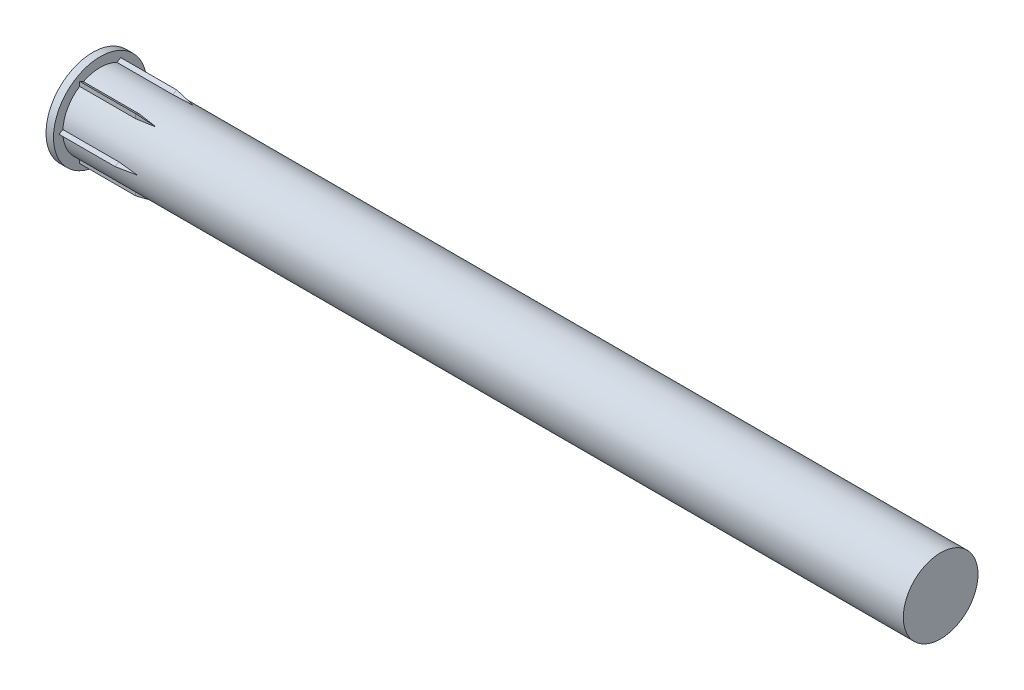
ISO-10303-21;
HEADER;
FILE_DESCRIPTION(('STEP AP214'),'2;1');
FILE_NAME('part.step','',(''),(''),'','','');
FILE_SCHEMA(('AUTOMOTIVE_DESIGN { 1 0 10303 214 1 1 1 1 }'));
ENDSEC;
DATA;
#1=APPLICATION_CONTEXT('core data for automotive mechanical design processes');
#2=APPLICATION_PROTOCOL_DEFINITION('international standard','automotive_design',2000,#1);
#3=PRODUCT_CONTEXT('',#1,'mechanical');
#4=PRODUCT('Part','Part','',(#3));
#5=PRODUCT_RELATED_PRODUCT_CATEGORY('part','',(#4));
#6=PRODUCT_DEFINITION_FORMATION('','',#4);
#7=PRODUCT_DEFINITION_CONTEXT('part definition',#1,'design');
#8=PRODUCT_DEFINITION('design','',#6,#7);
#9=PRODUCT_DEFINITION_SHAPE('','',#8);
#10=(LENGTH_UNIT() NAMED_UNIT(*) SI_UNIT(.MILLI.,.METRE.));
#11=(NAMED_UNIT(*) PLANE_ANGLE_UNIT() SI_UNIT($,.RADIAN.));
#12=(NAMED_UNIT(*) SI_UNIT($,.STERADIAN.) SOLID_ANGLE_UNIT());
#13=UNCERTAINTY_MEASURE_WITH_UNIT(LENGTH_MEASURE(1.E-05),#10,'distance_accuracy_value','');
#14=(GEOMETRIC_REPRESENTATION_CONTEXT(3) GLOBAL_UNCERTAINTY_ASSIGNED_CONTEXT((#13)) GLOBAL_UNIT_ASSIGNED_CONTEXT((#10,
#11,#12)) REPRESENTATION_CONTEXT('',''));
#15=CARTESIAN_POINT('',(0.,0.,0.));
#16=DIRECTION('',(0.,0.,1.));
#17=DIRECTION('',(1.,0.,0.));
#18=AXIS2_PLACEMENT_3D('',#15,#16,#17);
#19=CARTESIAN_POINT('',(3.,1.78779259859,0.896547614149));
#20=DIRECTION('',(0.0995037190192296,0.861727484432255,-0.497518595105147));
#21=DIRECTION('',(-0.980580675691602,0.,-0.196116135134773));
#22=AXIS2_PLACEMENT_3D('',#19,#20,#21);
#23=PLANE('',#22);
#24=CARTESIAN_POINT('',(3.0000000814,1.78779283971,0.896547133324));
#25=CARTESIAN_POINT('',(3.33074926986,1.77003985664,0.931948123239));
#26=CARTESIAN_POINT('',(3.66423295742,1.75143632677,0.96642330872));
#27=CARTESIAN_POINT('',(3.99999971952419,1.73205065846404,1.00000025825317));
#28=(BOUNDED_CURVE() B_SPLINE_CURVE(3,(#24,#25,#26,#27),.UNSPECIFIED.,.F.,
.F.) B_SPLINE_CURVE_WITH_KNOTS((4,4),(0.,1.00688422443),
.UNSPECIFIED.) CURVE() GEOMETRIC_REPRESENTATION_ITEM() RATIONAL_B_SPLINE_CURVE((1.,1.,1.,1.)) REPRESENTATION_ITEM(''));
#29=CARTESIAN_POINT('',(3.0000000814,1.78779283971,0.896547133324));
#30=VERTEX_POINT('',#29);
#31=CARTESIAN_POINT('',(3.99999974596,1.73205077294,1.00000005999));
#32=VERTEX_POINT('',#31);
#33=EDGE_CURVE('E261',#30,#32,#28,.T.);
#34=ORIENTED_EDGE('',*,*,#33,.F.);
#35=DIRECTION('',(0.,-0.50000000000019,-0.866025403784329));
#36=VECTOR('',#35,1.);
#37=CARTESIAN_POINT('',(3.,1.84652424346,0.998273807074));
#38=LINE('',#37,#36);
#39=CARTESIAN_POINT('',(3.,1.90525588833,1.1));
#40=VERTEX_POINT('',#39);
#41=EDGE_CURVE('E11',#40,#30,#38,.T.);
#42=ORIENTED_EDGE('',*,*,#41,.F.);
#43=DIRECTION('',(0.980580675690525,-0.169841555121918,-0.0980580675726525));
#44=VECTOR('',#43,1.);
#45=CARTESIAN_POINT('',(3.5,1.81865334795,1.05));
#46=LINE('',#45,#44);
#47=EDGE_CURVE('E221',#40,#32,#46,.T.);
#48=ORIENTED_EDGE('',*,*,#47,.T.);
#49=EDGE_LOOP('',(#34,#42,#48));
#50=FACE_BOUND('',#49,.T.);
#51=ADVANCED_FACE('F16',(#50),#23,.T.);
#52=CARTESIAN_POINT('',(3.,1.78779259859,0.896547614149));
#53=DIRECTION('',(0.,-0.866025403784329,0.50000000000019));
#54=DIRECTION('',(-1.,0.,0.));
#55=AXIS2_PLACEMENT_3D('',#52,#53,#54);
#56=PLANE('',#55);
#57=ORIENTED_EDGE('',*,*,#41,.T.);
#58=DIRECTION('',(1.,0.,0.));
#59=VECTOR('',#58,1.);
#60=CARTESIAN_POINT('',(22.5,1.78779259859,0.896547614152));
#61=LINE('',#60,#59);
#62=CARTESIAN_POINT('',(0.,1.78779265775987,0.896547496153935));
#63=VERTEX_POINT('',#62);
#64=EDGE_CURVE('E309',#63,#30,#61,.T.);
#65=ORIENTED_EDGE('',*,*,#64,.F.);
#66=DIRECTION('',(0.,0.50000000000019,0.866025403784329));
#67=VECTOR('',#66,1.);
#68=CARTESIAN_POINT('',(0.,1.2701705922195,0.));
#69=LINE('',#68,#67);
#70=CARTESIAN_POINT('',(0.,1.90525588833,1.1));
#71=VERTEX_POINT('',#70);
#72=EDGE_CURVE('E340',#63,#71,#69,.T.);
#73=ORIENTED_EDGE('',*,*,#72,.T.);
#74=DIRECTION('',(-1.,0.,0.));
#75=VECTOR('',#74,1.);
#76=CARTESIAN_POINT('',(1.5,1.90525588833,1.1));
#77=LINE('',#76,#75);
#78=EDGE_CURVE('E29',#40,#71,#77,.T.);
#79=ORIENTED_EDGE('',*,*,#78,.F.);
#80=EDGE_LOOP('',(#57,#65,#73,#79));
#81=FACE_BOUND('',#80,.T.);
#82=ADVANCED_FACE('F629',(#81),#56,.F.);
#83=CARTESIAN_POINT('',(3.,1.90525588833,1.1));
#84=DIRECTION('',(0.,0.,-1.));
#85=DIRECTION('',(0.,-1.,0.));
#86=AXIS2_PLACEMENT_3D('',#83,#84,#85);
#87=PLANE('',#86);
#88=DIRECTION('',(0.,1.,0.));
#89=VECTOR('',#88,1.);
#90=CARTESIAN_POINT('',(3.,1.78779259859,1.1));
#91=LINE('',#90,#89);
#92=CARTESIAN_POINT('',(3.,1.6703289507,1.10000054384));
#93=VERTEX_POINT('',#92);
#94=EDGE_CURVE('E214',#93,#40,#91,.T.);
#95=ORIENTED_EDGE('',*,*,#94,.T.);
#96=ORIENTED_EDGE('',*,*,#78,.T.);
#97=DIRECTION('',(0.,-1.,0.));
#98=VECTOR('',#97,1.);
#99=CARTESIAN_POINT('',(0.,0.,1.1));
#100=LINE('',#99,#98);
#101=CARTESIAN_POINT('',(0.,1.67032930884931,1.09999999999954));
#102=VERTEX_POINT('',#101);
#103=EDGE_CURVE('E368',#71,#102,#100,.T.);
#104=ORIENTED_EDGE('',*,*,#103,.T.);
#105=DIRECTION('',(1.,0.,0.));
#106=VECTOR('',#105,1.);
#107=CARTESIAN_POINT('',(22.5,1.6703289507,1.10000054384));
#108=LINE('',#107,#106);
#109=EDGE_CURVE('E258',#102,#93,#108,.T.);
#110=ORIENTED_EDGE('',*,*,#109,.T.);
#111=EDGE_LOOP('',(#95,#96,#104,#110));
#112=FACE_BOUND('',#111,.T.);
#113=ADVANCED_FACE('F592',(#112),#87,.F.);
#114=CARTESIAN_POINT('',(3.,1.90525588833,-1.1));
#115=DIRECTION('',(0.099503719024675,0.861727484431784,0.497518595104875));
#116=DIRECTION('',(0.980580675689518,0.,-0.196116135145196));
#117=AXIS2_PLACEMENT_3D('',#114,#115,#116);
#118=PLANE('',#117);
#119=CARTESIAN_POINT('',(3.99999964232,1.73205065542,-1.00000026353));
#120=CARTESIAN_POINT('',(3.66423269111,1.75143633091,-0.966423300439));
#121=CARTESIAN_POINT('',(3.33074913301,1.77003985436,-0.93194812715));
#122=CARTESIAN_POINT('',(3.00000007947,1.78779283323,-0.896547146257));
#123=(BOUNDED_CURVE() B_SPLINE_CURVE(3,(#119,#120,#121,#122),.UNSPECIFIED.,.F.,
.F.) B_SPLINE_CURVE_WITH_KNOTS((4,4),(0.,1.00688384735),
.UNSPECIFIED.) CURVE() GEOMETRIC_REPRESENTATION_ITEM() RATIONAL_B_SPLINE_CURVE((1.,1.,1.,1.)) REPRESENTATION_ITEM(''));
#124=CARTESIAN_POINT('',(3.99999964232,1.73205065542,-1.00000026353));
#125=VERTEX_POINT('',#124);
#126=CARTESIAN_POINT('',(3.,1.78779265776,-0.896547496155));
#127=VERTEX_POINT('',#126);
#128=EDGE_CURVE('E393',#125,#127,#123,.T.);
#129=ORIENTED_EDGE('',*,*,#128,.F.);
#130=DIRECTION('',(0.980580675690544,-0.169841555124921,0.0980580675672544));
#131=VECTOR('',#130,1.);
#132=CARTESIAN_POINT('',(3.5,1.81865334795,-1.05));
#133=LINE('',#132,#131);
#134=CARTESIAN_POINT('',(3.,1.90525588833,-1.1));
#135=VERTEX_POINT('',#134);
#136=EDGE_CURVE('E43',#135,#125,#133,.T.);
#137=ORIENTED_EDGE('',*,*,#136,.F.);
#138=DIRECTION('',(0.,0.50000000000019,-0.866025403784329));
#139=VECTOR('',#138,1.);
#140=CARTESIAN_POINT('',(3.,1.84652424346,-0.998273807075));
#141=LINE('',#140,#139);
#142=EDGE_CURVE('E425',#127,#135,#141,.T.);
#143=ORIENTED_EDGE('',*,*,#142,.F.);
#144=EDGE_LOOP('',(#129,#137,#143));
#145=FACE_BOUND('',#144,.T.);
#146=ADVANCED_FACE('F587',(#145),#118,.T.);
#147=CARTESIAN_POINT('',(3.,1.67032930885,-1.1));
#148=DIRECTION('',(0.0995037190192168,0.,-0.995037190210167));
#149=DIRECTION('',(0.,-1.,0.));
#150=AXIS2_PLACEMENT_3D('',#147,#148,#149);
#151=PLANE('',#150);
#152=CARTESIAN_POINT('',(3.0000001952,1.67032877235,-1.10000081466));
#153=CARTESIAN_POINT('',(3.33075141604,1.69211052877,-1.06692566237));
#154=CARTESIAN_POINT('',(3.66423436982,1.71266511661,-1.03357700148));
#155=CARTESIAN_POINT('',(3.99999961691528,1.73205076542671,-1.00000007299829));
#156=(BOUNDED_CURVE() B_SPLINE_CURVE(3,(#152,#153,#154,#155),.UNSPECIFIED.,.F.,
.F.) B_SPLINE_CURVE_WITH_KNOTS((4,4),(0.,1.00688440382),
.UNSPECIFIED.) CURVE() GEOMETRIC_REPRESENTATION_ITEM() RATIONAL_B_SPLINE_CURVE((1.,1.,1.,1.)) REPRESENTATION_ITEM(''));
#157=CARTESIAN_POINT('',(3.00000006506667,1.67032907056667,-1.10000009027));
#158=VERTEX_POINT('',#157);
#159=EDGE_CURVE('E385',#158,#125,#156,.T.);
#160=ORIENTED_EDGE('',*,*,#159,.F.);
#161=DIRECTION('',(0.,-1.,0.));
#162=VECTOR('',#161,1.);
#163=CARTESIAN_POINT('',(3.,1.78779259859,-1.1));
#164=LINE('',#163,#162);
#165=EDGE_CURVE('E445',#135,#158,#164,.T.);
#166=ORIENTED_EDGE('',*,*,#165,.F.);
#167=ORIENTED_EDGE('',*,*,#136,.T.);
#168=EDGE_LOOP('',(#160,#166,#167));
#169=FACE_BOUND('',#168,.T.);
#170=ADVANCED_FACE('F550',(#169),#151,.T.);
#171=CARTESIAN_POINT('',(3.,1.67032930885,-1.1));
#172=DIRECTION('',(0.,0.,1.));
#173=DIRECTION('',(0.,-1.,0.));
#174=AXIS2_PLACEMENT_3D('',#171,#172,#173);
#175=PLANE('',#174);
#176=ORIENTED_EDGE('',*,*,#165,.T.);
#177=DIRECTION('',(1.,3.33333360913457E-12,3.33333360913457E-12));
#178=VECTOR('',#177,1.);
#179=CARTESIAN_POINT('',(0.,1.67032966699,-1.09999945616));
#180=LINE('',#179,#178);
#181=CARTESIAN_POINT('',(0.,1.67032918946369,-1.10000000000024));
#182=VERTEX_POINT('',#181);
#183=EDGE_CURVE('E315',#182,#158,#180,.T.);
#184=ORIENTED_EDGE('',*,*,#183,.F.);
#185=DIRECTION('',(0.,1.,0.));
#186=VECTOR('',#185,1.);
#187=CARTESIAN_POINT('',(0.,0.,-1.1));
#188=LINE('',#187,#186);
#189=CARTESIAN_POINT('',(0.,1.90525588833,-1.1));
#190=VERTEX_POINT('',#189);
#191=EDGE_CURVE('E356',#182,#190,#188,.T.);
#192=ORIENTED_EDGE('',*,*,#191,.T.);
#193=DIRECTION('',(-1.,0.,0.));
#194=VECTOR('',#193,1.);
#195=CARTESIAN_POINT('',(1.5,1.90525588833,-1.1));
#196=LINE('',#195,#194);
#197=EDGE_CURVE('E429',#135,#190,#196,.T.);
#198=ORIENTED_EDGE('',*,*,#197,.F.);
#199=EDGE_LOOP('',(#176,#184,#192,#198));
#200=FACE_BOUND('',#199,.T.);
#201=ADVANCED_FACE('F544',(#200),#175,.F.);
#202=CARTESIAN_POINT('',(3.,1.90525588833,-1.1));
#203=DIRECTION('',(0.,-0.866025403784329,-0.50000000000019));
#204=DIRECTION('',(0.,0.50000000000019,-0.866025403784329));
#205=AXIS2_PLACEMENT_3D('',#202,#203,#204);
#206=PLANE('',#205);
#207=ORIENTED_EDGE('',*,*,#142,.T.);
#208=ORIENTED_EDGE('',*,*,#197,.T.);
#209=DIRECTION('',(0.,-0.50000000000019,0.866025403784329));
#210=VECTOR('',#209,1.);
#211=CARTESIAN_POINT('',(0.,1.27017059222109,0.));
#212=LINE('',#211,#210);
#213=CARTESIAN_POINT('',(0.,1.78779259858789,-0.896547614147941));
#214=VERTEX_POINT('',#213);
#215=EDGE_CURVE('E360',#190,#214,#212,.T.);
#216=ORIENTED_EDGE('',*,*,#215,.T.);
#217=DIRECTION('',(1.,0.,0.));
#218=VECTOR('',#217,1.);
#219=CARTESIAN_POINT('',(22.5,1.78779265776,-0.896547496155));
#220=LINE('',#219,#218);
#221=EDGE_CURVE('E389',#214,#127,#220,.T.);
#222=ORIENTED_EDGE('',*,*,#221,.T.);
#223=EDGE_LOOP('',(#207,#208,#216,#222));
#224=FACE_BOUND('',#223,.T.);
#225=ADVANCED_FACE('F549',(#224),#206,.F.);
#226=CARTESIAN_POINT('',(3.,0.,-2.2));
#227=DIRECTION('',(0.,-0.866025403784329,0.50000000000019));
#228=DIRECTION('',(-1.,0.,0.));
#229=AXIS2_PLACEMENT_3D('',#226,#227,#228);
#230=PLANE('',#229);
#231=DIRECTION('',(0.,-0.50000000000019,-0.866025403784329));
#232=VECTOR('',#231,1.);
#233=CARTESIAN_POINT('',(3.,0.0587316448692,-2.09827380707));
#234=LINE('',#233,#232);
#235=CARTESIAN_POINT('',(3.,0.117462990555,-1.99654763175));
#236=VERTEX_POINT('',#235);
#237=CARTESIAN_POINT('',(3.,0.,-2.2));
#238=VERTEX_POINT('',#237);
#239=EDGE_CURVE('E285',#236,#238,#234,.T.);
#240=ORIENTED_EDGE('',*,*,#239,.T.);
#241=DIRECTION('',(-1.,0.,0.));
#242=VECTOR('',#241,1.);
#243=CARTESIAN_POINT('',(1.5,0.,-2.2));
#244=LINE('',#243,#242);
#245=CARTESIAN_POINT('',(0.,0.,-2.2));
#246=VERTEX_POINT('',#245);
#247=EDGE_CURVE('E248',#238,#246,#244,.T.);
#248=ORIENTED_EDGE('',*,*,#247,.T.);
#249=DIRECTION('',(0.,0.50000000000019,0.866025403784329));
#250=VECTOR('',#249,1.);
#251=CARTESIAN_POINT('',(0.,1.27017059221779,0.));
#252=LINE('',#251,#250);
#253=CARTESIAN_POINT('',(0.,0.117463289737939,-1.99654761414897));
#254=VERTEX_POINT('',#253);
#255=EDGE_CURVE('E294',#246,#254,#252,.T.);
#256=ORIENTED_EDGE('',*,*,#255,.T.);
#257=DIRECTION('',(1.,0.,0.));
#258=VECTOR('',#257,1.);
#259=CARTESIAN_POINT('',(22.5,0.117462990555,-1.99654763175));
#260=LINE('',#259,#258);
#261=EDGE_CURVE('E247',#254,#236,#260,.T.);
#262=ORIENTED_EDGE('',*,*,#261,.T.);
#263=EDGE_LOOP('',(#240,#248,#256,#262));
#264=FACE_BOUND('',#263,.T.);
#265=ADVANCED_FACE('F643',(#264),#230,.F.);
#266=CARTESIAN_POINT('',(3.,-0.117463289738,-1.99654761415));
#267=DIRECTION('',(0.0995037190192297,-0.861727484432255,-0.497518595105147));
#268=DIRECTION('',(0.,0.500000000000065,-0.866025403784401));
#269=AXIS2_PLACEMENT_3D('',#266,#267,#268);
#270=PLANE('',#269);
#271=CARTESIAN_POINT('',(2.99999995628,-0.117463213623,-1.99654761863));
#272=CARTESIAN_POINT('',(3.33075069764,-0.0779285258454,-1.9988735694));
#273=CARTESIAN_POINT('',(3.66423759453,-0.0387706178968,-2.));
#274=CARTESIAN_POINT('',(4.00000000002,-4.29234967158E-13,-2.));
#275=(BOUNDED_CURVE() B_SPLINE_CURVE(3,(#271,#272,#273,#274),.UNSPECIFIED.,.F.,
.F.) B_SPLINE_CURVE_WITH_KNOTS((4,4),(0.,1.00688421947172),
.UNSPECIFIED.) CURVE() GEOMETRIC_REPRESENTATION_ITEM() RATIONAL_B_SPLINE_CURVE((1.,1.,1.,1.)) REPRESENTATION_ITEM(''));
#276=CARTESIAN_POINT('',(2.99999995628,-0.117463213623,-1.99654761863));
#277=VERTEX_POINT('',#276);
#278=CARTESIAN_POINT('',(3.99999999996,0.,-2.));
#279=VERTEX_POINT('',#278);
#280=EDGE_CURVE('E227',#277,#279,#275,.T.);
#281=ORIENTED_EDGE('',*,*,#280,.F.);
#282=DIRECTION('',(0.,-0.50000000000019,0.866025403784329));
#283=VECTOR('',#282,1.);
#284=CARTESIAN_POINT('',(3.,-0.0587316448692,-2.09827380707));
#285=LINE('',#284,#283);
#286=EDGE_CURVE('E240',#238,#277,#285,.T.);
#287=ORIENTED_EDGE('',*,*,#286,.F.);
#288=DIRECTION('',(0.980580675690574,-3.14045325067864E-12,0.196116135139915));
#289=VECTOR('',#288,1.);
#290=CARTESIAN_POINT('',(3.5,-1.5911647E-12,-2.1));
#291=LINE('',#290,#289);
#292=EDGE_CURVE('E254',#238,#279,#291,.T.);
#293=ORIENTED_EDGE('',*,*,#292,.T.);
#294=EDGE_LOOP('',(#281,#287,#293));
#295=FACE_BOUND('',#294,.T.);
#296=ADVANCED_FACE('F670',(#295),#270,.T.);
#297=CARTESIAN_POINT('',(3.,0.,-2.2));
#298=DIRECTION('',(0.099503719024675,0.861727484431784,-0.497518595104875));
#299=DIRECTION('',(-0.980580675689518,0.,-0.196116135145196));
#300=AXIS2_PLACEMENT_3D('',#297,#298,#299);
#301=PLANE('',#300);
#302=CARTESIAN_POINT('',(3.99999999996,-4.30128155315E-13,-2.));
#303=CARTESIAN_POINT('',(3.66423763016,0.0387706137776,-2.));
#304=CARTESIAN_POINT('',(3.3307506946,0.0779285261669,-1.99887356938));
#305=CARTESIAN_POINT('',(3.00000002574592,0.117463205204673,-1.99654761912069));
#306=(BOUNDED_CURVE() B_SPLINE_CURVE(3,(#302,#303,#304,#305),.UNSPECIFIED.,.F.,
.F.) B_SPLINE_CURVE_WITH_KNOTS((4,4),(0.,1.00688421984),
.UNSPECIFIED.) CURVE() GEOMETRIC_REPRESENTATION_ITEM() RATIONAL_B_SPLINE_CURVE((1.,1.,1.,1.)) REPRESENTATION_ITEM(''));
#307=EDGE_CURVE('E232',#279,#236,#306,.T.);
#308=ORIENTED_EDGE('',*,*,#307,.F.);
#309=ORIENTED_EDGE('',*,*,#292,.F.);
#310=ORIENTED_EDGE('',*,*,#239,.F.);
#311=EDGE_LOOP('',(#308,#309,#310));
#312=FACE_BOUND('',#311,.T.);
#313=ADVANCED_FACE('F675',(#312),#301,.T.);
#314=CARTESIAN_POINT('',(3.,-0.117463289738,-1.99654761415));
#315=DIRECTION('',(0.,0.866025403784329,0.50000000000019));
#316=DIRECTION('',(1.,0.,0.));
#317=AXIS2_PLACEMENT_3D('',#314,#315,#316);
#318=PLANE('',#317);
#319=ORIENTED_EDGE('',*,*,#286,.T.);
#320=DIRECTION('',(1.,0.,0.));
#321=VECTOR('',#320,1.);
#322=CARTESIAN_POINT('',(22.5,-0.117463289721,-1.99654761415));
#323=LINE('',#322,#321);
#324=CARTESIAN_POINT('',(0.,-0.117463289797733,-1.99654761414545));
#325=VERTEX_POINT('',#324);
#326=EDGE_CURVE('E415',#325,#277,#323,.T.);
#327=ORIENTED_EDGE('',*,*,#326,.F.);
#328=DIRECTION('',(0.,0.50000000000019,-0.866025403784329));
#329=VECTOR('',#328,1.);
#330=CARTESIAN_POINT('',(0.,-1.27017059221799,0.));
#331=LINE('',#330,#329);
#332=EDGE_CURVE('E298',#325,#246,#331,.T.);
#333=ORIENTED_EDGE('',*,*,#332,.T.);
#334=ORIENTED_EDGE('',*,*,#247,.F.);
#335=EDGE_LOOP('',(#319,#327,#333,#334));
#336=FACE_BOUND('',#335,.T.);
#337=ADVANCED_FACE('F707',(#336),#318,.F.);
#338=CARTESIAN_POINT('',(3.,-1.90525588833,-1.1));
#339=DIRECTION('',(0.0995037190246623,0.,-0.995037190209623));
#340=DIRECTION('',(0.,-1.,0.));
#341=AXIS2_PLACEMENT_3D('',#338,#339,#340);
#342=PLANE('',#341);
#343=CARTESIAN_POINT('',(3.99999974596,-1.73205077294,-1.00000005999));
#344=CARTESIAN_POINT('',(3.66423400158,-1.71266509398,-1.03357703819));
#345=CARTESIAN_POINT('',(3.33075123365,-1.69211051682,-1.06692568052));
#346=CARTESIAN_POINT('',(3.00000019575,-1.67032877242,-1.10000081456));
#347=(BOUNDED_CURVE() B_SPLINE_CURVE(3,(#343,#344,#345,#346),.UNSPECIFIED.,.F.,
.F.) B_SPLINE_CURVE_WITH_KNOTS((4,4),(0.,1.00688384355),
.UNSPECIFIED.) CURVE() GEOMETRIC_REPRESENTATION_ITEM() RATIONAL_B_SPLINE_CURVE((1.,1.,1.,1.)) REPRESENTATION_ITEM(''));
#348=CARTESIAN_POINT('',(3.99999974596,-1.73205077294,-1.00000005999));
#349=VERTEX_POINT('',#348);
#350=CARTESIAN_POINT('',(3.,-1.6703289507,-1.10000054384));
#351=VERTEX_POINT('',#350);
#352=EDGE_CURVE('E20',#349,#351,#347,.T.);
#353=ORIENTED_EDGE('',*,*,#352,.F.);
#354=DIRECTION('',(0.980580675690525,0.169841555121918,0.0980580675726525));
#355=VECTOR('',#354,1.);
#356=CARTESIAN_POINT('',(3.5,-1.81865334795,-1.05));
#357=LINE('',#356,#355);
#358=CARTESIAN_POINT('',(3.,-1.90525588833,-1.1));
#359=VERTEX_POINT('',#358);
#360=EDGE_CURVE('E233',#359,#349,#357,.T.);
#361=ORIENTED_EDGE('',*,*,#360,.F.);
#362=DIRECTION('',(0.,-1.,0.));
#363=VECTOR('',#362,1.);
#364=CARTESIAN_POINT('',(3.,-1.78779259859,-1.1));
#365=LINE('',#364,#363);
#366=EDGE_CURVE('E347',#351,#359,#365,.T.);
#367=ORIENTED_EDGE('',*,*,#366,.F.);
#368=EDGE_LOOP('',(#353,#361,#367));
#369=FACE_BOUND('',#368,.T.);
#370=ADVANCED_FACE('F504',(#369),#342,.T.);
#371=CARTESIAN_POINT('',(3.,-1.78779259859,-0.896547614149));
#372=DIRECTION('',(0.0995037190192296,-0.861727484432255,0.497518595105147));
#373=DIRECTION('',(-0.993399267799017,-0.114707866933253,0.));
#374=AXIS2_PLACEMENT_3D('',#371,#372,#373);
#375=PLANE('',#374);
#376=CARTESIAN_POINT('',(3.0000000814,-1.78779283971,-0.896547133324));
#377=CARTESIAN_POINT('',(3.33074926986,-1.77003985664,-0.931948123239));
#378=CARTESIAN_POINT('',(3.66423295742,-1.75143632677,-0.96642330872));
#379=CARTESIAN_POINT('',(3.99999971952419,-1.73205065846404,-1.00000025825317));
#380=(BOUNDED_CURVE() B_SPLINE_CURVE(3,(#376,#377,#378,#379),.UNSPECIFIED.,.F.,
.F.) B_SPLINE_CURVE_WITH_KNOTS((4,4),(0.,1.00688422443),
.UNSPECIFIED.) CURVE() GEOMETRIC_REPRESENTATION_ITEM() RATIONAL_B_SPLINE_CURVE((1.,1.,1.,1.)) REPRESENTATION_ITEM(''));
#381=CARTESIAN_POINT('',(3.0000000814,-1.78779283971,-0.896547133324));
#382=VERTEX_POINT('',#381);
#383=EDGE_CURVE('E262',#382,#349,#380,.T.);
#384=ORIENTED_EDGE('',*,*,#383,.F.);
#385=DIRECTION('',(0.,0.50000000000019,0.866025403784329));
#386=VECTOR('',#385,1.);
#387=CARTESIAN_POINT('',(3.,-1.84652424346,-0.998273807074));
#388=LINE('',#387,#386);
#389=EDGE_CURVE('E241',#359,#382,#388,.T.);
#390=ORIENTED_EDGE('',*,*,#389,.F.);
#391=ORIENTED_EDGE('',*,*,#360,.T.);
#392=EDGE_LOOP('',(#384,#390,#391));
#393=FACE_BOUND('',#392,.T.);
#394=ADVANCED_FACE('F509',(#393),#375,.T.);
#395=CARTESIAN_POINT('',(3.,-1.78779259859,-0.896547614149));
#396=DIRECTION('',(0.,0.866025403784329,-0.50000000000019));
#397=DIRECTION('',(-1.,0.,0.));
#398=AXIS2_PLACEMENT_3D('',#395,#396,#397);
#399=PLANE('',#398);
#400=ORIENTED_EDGE('',*,*,#389,.T.);
#401=DIRECTION('',(1.,0.,0.));
#402=VECTOR('',#401,1.);
#403=CARTESIAN_POINT('',(22.5,-1.78779259859,-0.896547614152));
#404=LINE('',#403,#402);
#405=CARTESIAN_POINT('',(0.,-1.78779265775987,-0.896547496153936));
#406=VERTEX_POINT('',#405);
#407=EDGE_CURVE('E268',#406,#382,#404,.T.);
#408=ORIENTED_EDGE('',*,*,#407,.F.);
#409=DIRECTION('',(0.,-0.50000000000019,-0.866025403784329));
#410=VECTOR('',#409,1.);
#411=CARTESIAN_POINT('',(0.,-1.2701705922195,0.));
#412=LINE('',#411,#410);
#413=CARTESIAN_POINT('',(0.,-1.90525588833,-1.1));
#414=VERTEX_POINT('',#413);
#415=EDGE_CURVE('E291',#406,#414,#412,.T.);
#416=ORIENTED_EDGE('',*,*,#415,.T.);
#417=DIRECTION('',(-1.,0.,0.));
#418=VECTOR('',#417,1.);
#419=CARTESIAN_POINT('',(1.5,-1.90525588833,-1.1));
#420=LINE('',#419,#418);
#421=EDGE_CURVE('E352',#359,#414,#420,.T.);
#422=ORIENTED_EDGE('',*,*,#421,.F.);
#423=EDGE_LOOP('',(#400,#408,#416,#422));
#424=FACE_BOUND('',#423,.T.);
#425=ADVANCED_FACE('F511',(#424),#399,.F.);
#426=CARTESIAN_POINT('',(3.,-1.90525588833,-1.1));
#427=DIRECTION('',(0.,0.,1.));
#428=DIRECTION('',(0.,-1.,0.));
#429=AXIS2_PLACEMENT_3D('',#426,#427,#428);
#430=PLANE('',#429);
#431=ORIENTED_EDGE('',*,*,#366,.T.);
#432=ORIENTED_EDGE('',*,*,#421,.T.);
#433=DIRECTION('',(0.,1.,0.));
#434=VECTOR('',#433,1.);
#435=CARTESIAN_POINT('',(0.,0.,-1.1));
#436=LINE('',#435,#434);
#437=CARTESIAN_POINT('',(0.,-1.67032930884931,-1.09999999999954));
#438=VERTEX_POINT('',#437);
#439=EDGE_CURVE('E351',#414,#438,#436,.T.);
#440=ORIENTED_EDGE('',*,*,#439,.T.);
#441=DIRECTION('',(1.,0.,0.));
#442=VECTOR('',#441,1.);
#443=CARTESIAN_POINT('',(22.5,-1.6703289507,-1.10000054384));
#444=LINE('',#443,#442);
#445=EDGE_CURVE('E411',#438,#351,#444,.T.);
#446=ORIENTED_EDGE('',*,*,#445,.T.);
#447=EDGE_LOOP('',(#431,#432,#440,#446));
#448=FACE_BOUND('',#447,.T.);
#449=ADVANCED_FACE('F514',(#448),#430,.F.);
#450=CARTESIAN_POINT('',(3.,-1.90525588833,1.1));
#451=DIRECTION('',(0.099503719024675,-0.861727484431784,-0.497518595104875));
#452=DIRECTION('',(0.,0.500000000000064,-0.866025403784402));
#453=AXIS2_PLACEMENT_3D('',#450,#451,#452);
#454=PLANE('',#453);
#455=CARTESIAN_POINT('',(3.99999964231,-1.73205065542,1.00000026353));
#456=CARTESIAN_POINT('',(3.6642326911,-1.75143633091,0.966423300439));
#457=CARTESIAN_POINT('',(3.33074913301,-1.77003985436,0.931948127151));
#458=CARTESIAN_POINT('',(3.00000007947,-1.78779283323,0.896547146258));
#459=(BOUNDED_CURVE() B_SPLINE_CURVE(3,(#455,#456,#457,#458),.UNSPECIFIED.,.F.,
.F.) B_SPLINE_CURVE_WITH_KNOTS((4,4),(0.,1.00688384734),
.UNSPECIFIED.) CURVE() GEOMETRIC_REPRESENTATION_ITEM() RATIONAL_B_SPLINE_CURVE((1.,1.,1.,1.)) REPRESENTATION_ITEM(''));
#460=CARTESIAN_POINT('',(3.99999964231,-1.73205065542,1.00000026353));
#461=VERTEX_POINT('',#460);
#462=CARTESIAN_POINT('',(3.,-1.78779265776,0.896547496154));
#463=VERTEX_POINT('',#462);
#464=EDGE_CURVE('E269',#461,#463,#459,.T.);
#465=ORIENTED_EDGE('',*,*,#464,.F.);
#466=DIRECTION('',(0.980580675690544,0.169841555124921,-0.0980580675672544));
#467=VECTOR('',#466,1.);
#468=CARTESIAN_POINT('',(3.5,-1.81865334795,1.05));
#469=LINE('',#468,#467);
#470=CARTESIAN_POINT('',(3.,-1.90525588833,1.1));
#471=VERTEX_POINT('',#470);
#472=EDGE_CURVE('E327',#471,#461,#469,.T.);
#473=ORIENTED_EDGE('',*,*,#472,.F.);
#474=DIRECTION('',(0.,-0.50000000000019,0.866025403784329));
#475=VECTOR('',#474,1.);
#476=CARTESIAN_POINT('',(3.,-1.84652424346,0.998273807075));
#477=LINE('',#476,#475);
#478=EDGE_CURVE('E226',#463,#471,#477,.T.);
#479=ORIENTED_EDGE('',*,*,#478,.F.);
#480=EDGE_LOOP('',(#465,#473,#479));
#481=FACE_BOUND('',#480,.T.);
#482=ADVANCED_FACE('F650',(#481),#454,.T.);
#483=CARTESIAN_POINT('',(3.,-1.67032930885,1.1));
#484=DIRECTION('',(0.0995037190192168,0.,0.995037190210167));
#485=DIRECTION('',(0.,-1.,0.));
#486=AXIS2_PLACEMENT_3D('',#483,#484,#485);
#487=PLANE('',#486);
#488=CARTESIAN_POINT('',(3.0000001952,-1.67032877235,1.10000081466));
#489=CARTESIAN_POINT('',(3.33075141604,-1.69211052877,1.06692566237));
#490=CARTESIAN_POINT('',(3.66423436982,-1.71266511661,1.03357700148));
#491=CARTESIAN_POINT('',(3.99999961690541,-1.73205076542615,1.00000007299928));
#492=(BOUNDED_CURVE() B_SPLINE_CURVE(3,(#488,#489,#490,#491),.UNSPECIFIED.,.F.,
.F.) B_SPLINE_CURVE_WITH_KNOTS((4,4),(0.,1.00688440382),
.UNSPECIFIED.) CURVE() GEOMETRIC_REPRESENTATION_ITEM() RATIONAL_B_SPLINE_CURVE((1.,1.,1.,1.)) REPRESENTATION_ITEM(''));
#493=CARTESIAN_POINT('',(3.00000006506667,-1.67032907056667,1.10000009027));
#494=VERTEX_POINT('',#493);
#495=EDGE_CURVE('E279',#494,#461,#492,.T.);
#496=ORIENTED_EDGE('',*,*,#495,.F.);
#497=DIRECTION('',(0.,1.,0.));
#498=VECTOR('',#497,1.);
#499=CARTESIAN_POINT('',(3.,-1.78779259859,1.1));
#500=LINE('',#499,#498);
#501=EDGE_CURVE('E225',#471,#494,#500,.T.);
#502=ORIENTED_EDGE('',*,*,#501,.F.);
#503=ORIENTED_EDGE('',*,*,#472,.T.);
#504=EDGE_LOOP('',(#496,#502,#503));
#505=FACE_BOUND('',#504,.T.);
#506=ADVANCED_FACE('F655',(#505),#487,.T.);
#507=CARTESIAN_POINT('',(3.,-1.67032930885,1.1));
#508=DIRECTION('',(0.,0.,-1.));
#509=DIRECTION('',(-1.,0.,0.));
#510=AXIS2_PLACEMENT_3D('',#507,#508,#509);
#511=PLANE('',#510);
#512=ORIENTED_EDGE('',*,*,#501,.T.);
#513=DIRECTION('',(1.,-3.33333360913457E-12,-3.33333360913457E-12));
#514=VECTOR('',#513,1.);
#515=CARTESIAN_POINT('',(0.,-1.67032966699,1.09999945616));
#516=LINE('',#515,#514);
#517=CARTESIAN_POINT('',(0.,-1.67032918946369,1.10000000000024));
#518=VERTEX_POINT('',#517);
#519=EDGE_CURVE('E193',#518,#494,#516,.T.);
#520=ORIENTED_EDGE('',*,*,#519,.F.);
#521=DIRECTION('',(0.,-1.,0.));
#522=VECTOR('',#521,1.);
#523=CARTESIAN_POINT('',(0.,0.,1.1));
#524=LINE('',#523,#522);
#525=CARTESIAN_POINT('',(0.,-1.90525588833,1.1));
#526=VERTEX_POINT('',#525);
#527=EDGE_CURVE('E364',#518,#526,#524,.T.);
#528=ORIENTED_EDGE('',*,*,#527,.T.);
#529=DIRECTION('',(-1.,0.,0.));
#530=VECTOR('',#529,1.);
#531=CARTESIAN_POINT('',(1.5,-1.90525588833,1.1));
#532=LINE('',#531,#530);
#533=EDGE_CURVE('E222',#471,#526,#532,.T.);
#534=ORIENTED_EDGE('',*,*,#533,.F.);
#535=EDGE_LOOP('',(#512,#520,#528,#534));
#536=FACE_BOUND('',#535,.T.);
#537=ADVANCED_FACE('F454',(#536),#511,.F.);
#538=CARTESIAN_POINT('',(3.,-1.90525588833,1.1));
#539=DIRECTION('',(0.,0.866025403784329,0.50000000000019));
#540=DIRECTION('',(1.,0.,0.));
#541=AXIS2_PLACEMENT_3D('',#538,#539,#540);
#542=PLANE('',#541);
#543=ORIENTED_EDGE('',*,*,#478,.T.);
#544=ORIENTED_EDGE('',*,*,#533,.T.);
#545=DIRECTION('',(0.,0.50000000000019,-0.866025403784329));
#546=VECTOR('',#545,1.);
#547=CARTESIAN_POINT('',(0.,-1.27017059222109,0.));
#548=LINE('',#547,#546);
#549=CARTESIAN_POINT('',(0.,-1.78779259858789,0.896547614147941));
#550=VERTEX_POINT('',#549);
#551=EDGE_CURVE('E290',#526,#550,#548,.T.);
#552=ORIENTED_EDGE('',*,*,#551,.T.);
#553=DIRECTION('',(1.,0.,0.));
#554=VECTOR('',#553,1.);
#555=CARTESIAN_POINT('',(22.5,-1.78779265776,0.896547496154));
#556=LINE('',#555,#554);
#557=EDGE_CURVE('E278',#550,#463,#556,.T.);
#558=ORIENTED_EDGE('',*,*,#557,.T.);
#559=EDGE_LOOP('',(#543,#544,#552,#558));
#560=FACE_BOUND('',#559,.T.);
#561=ADVANCED_FACE('F463',(#560),#542,.F.);
#562=CARTESIAN_POINT('',(3.,0.117463289738,1.99654761415));
#563=DIRECTION('',(0.0995037190192296,0.861727484432255,0.497518595105147));
#564=DIRECTION('',(0.980580675691602,0.,-0.196116135134773));
#565=AXIS2_PLACEMENT_3D('',#562,#563,#564);
#566=PLANE('',#565);
#567=CARTESIAN_POINT('',(2.99999995629,0.117463213622,1.99654761863));
#568=CARTESIAN_POINT('',(3.33075069764,0.077928525845,1.9988735694));
#569=CARTESIAN_POINT('',(3.66423759453,0.0387706178963,2.));
#570=CARTESIAN_POINT('',(4.00000000002,0.,2.));
#571=(BOUNDED_CURVE() B_SPLINE_CURVE(3,(#567,#568,#569,#570),.UNSPECIFIED.,.F.,
.F.) B_SPLINE_CURVE_WITH_KNOTS((4,4),(0.,1.00688421947163),
.UNSPECIFIED.) CURVE() GEOMETRIC_REPRESENTATION_ITEM() RATIONAL_B_SPLINE_CURVE((1.,1.,1.,1.)) REPRESENTATION_ITEM(''));
#572=CARTESIAN_POINT('',(2.99999995629,0.117463213622,1.99654761863));
#573=VERTEX_POINT('',#572);
#574=CARTESIAN_POINT('',(3.99999999996,0.,2.));
#575=VERTEX_POINT('',#574);
#576=EDGE_CURVE('E199',#573,#575,#571,.T.);
#577=ORIENTED_EDGE('',*,*,#576,.F.);
#578=DIRECTION('',(0.,0.50000000000019,-0.866025403784329));
#579=VECTOR('',#578,1.);
#580=CARTESIAN_POINT('',(3.,0.0587316448692,2.09827380707));
#581=LINE('',#580,#579);
#582=CARTESIAN_POINT('',(3.,0.,2.2));
#583=VERTEX_POINT('',#582);
#584=EDGE_CURVE('E255',#583,#573,#581,.T.);
#585=ORIENTED_EDGE('',*,*,#584,.F.);
#586=DIRECTION('',(0.980580675690574,3.14046685896864E-12,-0.196116135139915));
#587=VECTOR('',#586,1.);
#588=CARTESIAN_POINT('',(3.5,1.5904777495E-12,2.1));
#589=LINE('',#588,#587);
#590=EDGE_CURVE('E179',#583,#575,#589,.T.);
#591=ORIENTED_EDGE('',*,*,#590,.T.);
#592=EDGE_LOOP('',(#577,#585,#591));
#593=FACE_BOUND('',#592,.T.);
#594=ADVANCED_FACE('F537',(#593),#566,.T.);
#595=CARTESIAN_POINT('',(3.,0.117463289738,1.99654761415));
#596=DIRECTION('',(0.,-0.866025403784329,-0.50000000000019));
#597=DIRECTION('',(0.,0.50000000000019,-0.866025403784329));
#598=AXIS2_PLACEMENT_3D('',#595,#596,#597);
#599=PLANE('',#598);
#600=ORIENTED_EDGE('',*,*,#584,.T.);
#601=DIRECTION('',(1.,0.,0.));
#602=VECTOR('',#601,1.);
#603=CARTESIAN_POINT('',(22.5,0.117463289721,1.99654761415));
#604=LINE('',#603,#602);
#605=CARTESIAN_POINT('',(0.,0.117463289797733,1.99654761414545));
#606=VERTEX_POINT('',#605);
#607=EDGE_CURVE('E206',#606,#573,#604,.T.);
#608=ORIENTED_EDGE('',*,*,#607,.F.);
#609=DIRECTION('',(0.,-0.50000000000019,0.866025403784329));
#610=VECTOR('',#609,1.);
#611=CARTESIAN_POINT('',(0.,1.27017059221799,0.));
#612=LINE('',#611,#610);
#613=CARTESIAN_POINT('',(0.,0.,2.2));
#614=VERTEX_POINT('',#613);
#615=EDGE_CURVE('E300',#606,#614,#612,.T.);
#616=ORIENTED_EDGE('',*,*,#615,.T.);
#617=DIRECTION('',(-1.,0.,0.));
#618=VECTOR('',#617,1.);
#619=CARTESIAN_POINT('',(1.5,0.,2.2));
#620=LINE('',#619,#618);
#621=EDGE_CURVE('E182',#583,#614,#620,.T.);
#622=ORIENTED_EDGE('',*,*,#621,.F.);
#623=EDGE_LOOP('',(#600,#608,#616,#622));
#624=FACE_BOUND('',#623,.T.);
#625=ADVANCED_FACE('F598',(#624),#599,.F.);
#626=CARTESIAN_POINT('',(3.,0.,2.2));
#627=DIRECTION('',(0.,0.866025403784329,-0.50000000000019));
#628=DIRECTION('',(-1.,0.,0.));
#629=AXIS2_PLACEMENT_3D('',#626,#627,#628);
#630=PLANE('',#629);
#631=DIRECTION('',(0.,0.50000000000019,0.866025403784329));
#632=VECTOR('',#631,1.);
#633=CARTESIAN_POINT('',(3.,-0.0587316448692,2.09827380707));
#634=LINE('',#633,#632);
#635=CARTESIAN_POINT('',(3.,-0.117462990555,1.99654763175));
#636=VERTEX_POINT('',#635);
#637=EDGE_CURVE('E173',#636,#583,#634,.T.);
#638=ORIENTED_EDGE('',*,*,#637,.T.);
#639=ORIENTED_EDGE('',*,*,#621,.T.);
#640=DIRECTION('',(0.,-0.50000000000019,-0.866025403784329));
#641=VECTOR('',#640,1.);
#642=CARTESIAN_POINT('',(0.,-1.27017059221779,0.));
#643=LINE('',#642,#641);
#644=CARTESIAN_POINT('',(0.,-0.117463289737939,1.99654761414897));
#645=VERTEX_POINT('',#644);
#646=EDGE_CURVE('E188',#614,#645,#643,.T.);
#647=ORIENTED_EDGE('',*,*,#646,.T.);
#648=DIRECTION('',(1.,0.,0.));
#649=VECTOR('',#648,1.);
#650=CARTESIAN_POINT('',(22.5,-0.117462990555,1.99654763175));
#651=LINE('',#650,#649);
#652=EDGE_CURVE('E185',#645,#636,#651,.T.);
#653=ORIENTED_EDGE('',*,*,#652,.T.);
#654=EDGE_LOOP('',(#638,#639,#647,#653));
#655=FACE_BOUND('',#654,.T.);
#656=ADVANCED_FACE('F186',(#655),#630,.F.);
#657=CARTESIAN_POINT('',(3.,0.,2.2));
#658=DIRECTION('',(0.099503719024675,-0.861727484431784,0.497518595104875));
#659=DIRECTION('',(-0.993399267798295,-0.11470786693951,0.));
#660=AXIS2_PLACEMENT_3D('',#657,#658,#659);
#661=PLANE('',#660);
#662=CARTESIAN_POINT('',(3.99999999996,0.,2.));
#663=CARTESIAN_POINT('',(3.66423763016,-0.038770613778,2.));
#664=CARTESIAN_POINT('',(3.3307506946,-0.0779285261674,1.99887356938));
#665=CARTESIAN_POINT('',(3.00000002574592,-0.117463205204673,1.99654761912069));
#666=(BOUNDED_CURVE() B_SPLINE_CURVE(3,(#662,#663,#664,#665),.UNSPECIFIED.,.F.,
.F.) B_SPLINE_CURVE_WITH_KNOTS((4,4),(0.,1.00688421984),
.UNSPECIFIED.) CURVE() GEOMETRIC_REPRESENTATION_ITEM() RATIONAL_B_SPLINE_CURVE((1.,1.,1.,1.)) REPRESENTATION_ITEM(''));
#667=EDGE_CURVE('E177',#575,#636,#666,.T.);
#668=ORIENTED_EDGE('',*,*,#667,.F.);
#669=ORIENTED_EDGE('',*,*,#590,.F.);
#670=ORIENTED_EDGE('',*,*,#637,.F.);
#671=EDGE_LOOP('',(#668,#669,#670));
#672=FACE_BOUND('',#671,.T.);
#673=ADVANCED_FACE('F175',(#672),#661,.T.);
#674=CARTESIAN_POINT('',(0.,0.,0.));
#675=DIRECTION('',(1.,0.,0.));
#676=DIRECTION('',(0.,0.,1.));
#677=AXIS2_PLACEMENT_3D('',#674,#675,#676);
#678=CYLINDRICAL_SURFACE('',#677,2.);
#679=CARTESIAN_POINT('',(45.,0.,0.));
#680=DIRECTION('',(1.,0.,0.));
#681=DIRECTION('',(0.,1.,0.));
#682=AXIS2_PLACEMENT_3D('',#679,#680,#681);
#683=CIRCLE('',#682,2.);
#684=CARTESIAN_POINT('',(45.,0.,-2.));
#685=VERTEX_POINT('',#684);
#686=EDGE_CURVE('E220',#685,#685,#683,.T.);
#687=ORIENTED_EDGE('',*,*,#686,.F.);
#688=EDGE_LOOP('',(#687));
#689=FACE_BOUND('',#688,.T.);
#690=ORIENTED_EDGE('',*,*,#280,.T.);
#691=ORIENTED_EDGE('',*,*,#307,.T.);
#692=ORIENTED_EDGE('',*,*,#261,.F.);
#693=CARTESIAN_POINT('',(0.,0.,0.));
#694=DIRECTION('',(1.,0.,0.));
#695=DIRECTION('',(0.,0.,1.));
#696=AXIS2_PLACEMENT_3D('',#693,#694,#695);
#697=CIRCLE('',#696,2.);
#698=EDGE_CURVE('E299',#254,#182,#697,.T.);
#699=ORIENTED_EDGE('',*,*,#698,.T.);
#700=ORIENTED_EDGE('',*,*,#183,.T.);
#701=ORIENTED_EDGE('',*,*,#159,.T.);
#702=ORIENTED_EDGE('',*,*,#128,.T.);
#703=ORIENTED_EDGE('',*,*,#221,.F.);
#704=CARTESIAN_POINT('',(0.,0.,0.));
#705=DIRECTION('',(1.,0.,0.));
#706=DIRECTION('',(0.,0.,1.));
#707=AXIS2_PLACEMENT_3D('',#704,#705,#706);
#708=CIRCLE('',#707,2.);
#709=EDGE_CURVE('E212',#214,#63,#708,.T.);
#710=ORIENTED_EDGE('',*,*,#709,.T.);
#711=ORIENTED_EDGE('',*,*,#64,.T.);
#712=ORIENTED_EDGE('',*,*,#33,.T.);
#713=CARTESIAN_POINT('',(3.99999974596,1.73205077294,1.00000005999));
#714=CARTESIAN_POINT('',(3.66423400158,1.71266509398,1.03357703819));
#715=CARTESIAN_POINT('',(3.33075123365,1.69211051682,1.06692568052));
#716=CARTESIAN_POINT('',(3.00000019575,1.67032877242,1.10000081456));
#717=(BOUNDED_CURVE() B_SPLINE_CURVE(3,(#713,#714,#715,#716),.UNSPECIFIED.,.F.,
.F.) B_SPLINE_CURVE_WITH_KNOTS((4,4),(0.,1.00688384355),
.UNSPECIFIED.) CURVE() GEOMETRIC_REPRESENTATION_ITEM() RATIONAL_B_SPLINE_CURVE((1.,1.,1.,1.)) REPRESENTATION_ITEM(''));
#718=EDGE_CURVE('E334',#32,#93,#717,.T.);
#719=ORIENTED_EDGE('',*,*,#718,.T.);
#720=ORIENTED_EDGE('',*,*,#109,.F.);
#721=CARTESIAN_POINT('',(0.,0.,0.));
#722=DIRECTION('',(1.,0.,0.));
#723=DIRECTION('',(0.,0.,1.));
#724=AXIS2_PLACEMENT_3D('',#721,#722,#723);
#725=CIRCLE('',#724,2.);
#726=EDGE_CURVE('E304',#102,#606,#725,.T.);
#727=ORIENTED_EDGE('',*,*,#726,.T.);
#728=ORIENTED_EDGE('',*,*,#607,.T.);
#729=ORIENTED_EDGE('',*,*,#576,.T.);
#730=ORIENTED_EDGE('',*,*,#667,.T.);
#731=ORIENTED_EDGE('',*,*,#652,.F.);
#732=CARTESIAN_POINT('',(0.,0.,0.));
#733=DIRECTION('',(1.,0.,0.));
#734=DIRECTION('',(0.,0.,1.));
#735=AXIS2_PLACEMENT_3D('',#732,#733,#734);
#736=CIRCLE('',#735,2.);
#737=EDGE_CURVE('E421',#645,#518,#736,.T.);
#738=ORIENTED_EDGE('',*,*,#737,.T.);
#739=ORIENTED_EDGE('',*,*,#519,.T.);
#740=ORIENTED_EDGE('',*,*,#495,.T.);
#741=ORIENTED_EDGE('',*,*,#464,.T.);
#742=ORIENTED_EDGE('',*,*,#557,.F.);
#743=CARTESIAN_POINT('',(0.,0.,0.));
#744=DIRECTION('',(1.,0.,0.));
#745=DIRECTION('',(0.,0.,1.));
#746=AXIS2_PLACEMENT_3D('',#743,#744,#745);
#747=CIRCLE('',#746,2.);
#748=EDGE_CURVE('E286',#550,#406,#747,.T.);
#749=ORIENTED_EDGE('',*,*,#748,.T.);
#750=ORIENTED_EDGE('',*,*,#407,.T.);
#751=ORIENTED_EDGE('',*,*,#383,.T.);
#752=ORIENTED_EDGE('',*,*,#352,.T.);
#753=ORIENTED_EDGE('',*,*,#445,.F.);
#754=CARTESIAN_POINT('',(0.,0.,0.));
#755=DIRECTION('',(1.,0.,0.));
#756=DIRECTION('',(0.,0.,1.));
#757=AXIS2_PLACEMENT_3D('',#754,#755,#756);
#758=CIRCLE('',#757,2.);
#759=EDGE_CURVE('E375',#438,#325,#758,.T.);
#760=ORIENTED_EDGE('',*,*,#759,.T.);
#761=ORIENTED_EDGE('',*,*,#326,.T.);
#762=EDGE_LOOP('',(#690,#691,#692,#699,#700,#701,#702,#703,#710,#711,#712,#719,#720,#727,#728,
#729,#730,#731,#738,#739,#740,#741,#742,#749,#750,#751,#752,#753,#760,#761));
#763=FACE_BOUND('',#762,.T.);
#764=ADVANCED_FACE('F196',(#689,#763),#678,.T.);
#765=CARTESIAN_POINT('',(45.,0.,0.));
#766=DIRECTION('',(1.,0.,0.));
#767=DIRECTION('',(0.,1.,0.));
#768=AXIS2_PLACEMENT_3D('',#765,#766,#767);
#769=PLANE('',#768);
#770=ORIENTED_EDGE('',*,*,#686,.T.);
#771=EDGE_LOOP('',(#770));
#772=FACE_BOUND('',#771,.T.);
#773=ADVANCED_FACE('F524',(#772),#769,.T.);
#774=CARTESIAN_POINT('',(3.,1.90525588833,1.1));
#775=DIRECTION('',(0.0995037190246623,0.,0.995037190209623));
#776=DIRECTION('',(0.,-1.,0.));
#777=AXIS2_PLACEMENT_3D('',#774,#775,#776);
#778=PLANE('',#777);
#779=ORIENTED_EDGE('',*,*,#718,.F.);
#780=ORIENTED_EDGE('',*,*,#47,.F.);
#781=ORIENTED_EDGE('',*,*,#94,.F.);
#782=EDGE_LOOP('',(#779,#780,#781));
#783=FACE_BOUND('',#782,.T.);
#784=ADVANCED_FACE('F558',(#783),#778,.T.);
#785=CARTESIAN_POINT('',(0.,0.,0.));
#786=DIRECTION('',(-1.,0.,0.));
#787=DIRECTION('',(0.,0.,1.));
#788=AXIS2_PLACEMENT_3D('',#785,#786,#787);
#789=PLANE('',#788);
#790=ORIENTED_EDGE('',*,*,#709,.F.);
#791=ORIENTED_EDGE('',*,*,#215,.F.);
#792=ORIENTED_EDGE('',*,*,#191,.F.);
#793=ORIENTED_EDGE('',*,*,#698,.F.);
#794=ORIENTED_EDGE('',*,*,#255,.F.);
#795=ORIENTED_EDGE('',*,*,#332,.F.);
#796=ORIENTED_EDGE('',*,*,#759,.F.);
#797=ORIENTED_EDGE('',*,*,#439,.F.);
#798=ORIENTED_EDGE('',*,*,#415,.F.);
#799=ORIENTED_EDGE('',*,*,#748,.F.);
#800=ORIENTED_EDGE('',*,*,#551,.F.);
#801=ORIENTED_EDGE('',*,*,#527,.F.);
#802=ORIENTED_EDGE('',*,*,#737,.F.);
#803=ORIENTED_EDGE('',*,*,#646,.F.);
#804=ORIENTED_EDGE('',*,*,#615,.F.);
#805=ORIENTED_EDGE('',*,*,#726,.F.);
#806=ORIENTED_EDGE('',*,*,#103,.F.);
#807=ORIENTED_EDGE('',*,*,#72,.F.);
#808=EDGE_LOOP('',(#790,#791,#792,#793,#794,#795,#796,#797,#798,#799,#800,#801,#802,#803,#804,
#805,#806,#807));
#809=FACE_BOUND('',#808,.T.);
#810=CARTESIAN_POINT('',(0.,0.,0.));
#811=DIRECTION('',(-1.,0.,0.));
#812=DIRECTION('',(0.,1.,0.));
#813=AXIS2_PLACEMENT_3D('',#810,#811,#812);
#814=CIRCLE('',#813,2.5);
#815=CARTESIAN_POINT('',(0.,0.,2.5));
#816=VERTEX_POINT('',#815);
#817=EDGE_CURVE('E329',#816,#816,#814,.T.);
#818=ORIENTED_EDGE('',*,*,#817,.F.);
#819=EDGE_LOOP('',(#818));
#820=FACE_BOUND('',#819,.T.);
#821=ADVANCED_FACE('F18',(#809,#820),#789,.F.);
#822=CARTESIAN_POINT('',(0.,0.,0.));
#823=DIRECTION('',(-1.,0.,0.));
#824=DIRECTION('',(0.,0.,1.));
#825=AXIS2_PLACEMENT_3D('',#822,#823,#824);
#826=CYLINDRICAL_SURFACE('',#825,2.5);
#827=CARTESIAN_POINT('',(-0.4,0.,0.));
#828=DIRECTION('',(-1.,0.,0.));
#829=DIRECTION('',(0.,1.,0.));
#830=AXIS2_PLACEMENT_3D('',#827,#828,#829);
#831=CIRCLE('',#830,2.5);
#832=CARTESIAN_POINT('',(-0.4,0.,2.5));
#833=VERTEX_POINT('',#832);
#834=EDGE_CURVE('E332',#833,#833,#831,.T.);
#835=ORIENTED_EDGE('',*,*,#834,.F.);
#836=EDGE_LOOP('',(#835));
#837=FACE_BOUND('',#836,.T.);
#838=ORIENTED_EDGE('',*,*,#817,.T.);
#839=EDGE_LOOP('',(#838));
#840=FACE_BOUND('',#839,.T.);
#841=ADVANCED_FACE('F614',(#837,#840),#826,.T.);
#842=CARTESIAN_POINT('',(-0.4,0.,0.));
#843=DIRECTION('',(-1.,0.,0.));
#844=DIRECTION('',(0.,0.,1.));
#845=AXIS2_PLACEMENT_3D('',#842,#843,#844);
#846=PLANE('',#845);
#847=ORIENTED_EDGE('',*,*,#834,.T.);
#848=EDGE_LOOP('',(#847));
#849=FACE_BOUND('',#848,.T.);
#850=ADVANCED_FACE('F609',(#849),#846,.T.);
#851=CLOSED_SHELL('',(#51,#82,#113,#146,#170,#201,#225,#265,#296,#313,#337,#370,#394,#425,#449,
#482,#506,#537,#561,#594,#625,#656,#673,#764,#773,#784,#821,#841,#850));
#852=MANIFOLD_SOLID_BREP('B1',#851);
#853=ADVANCED_BREP_SHAPE_REPRESENTATION('',(#18,#852),#14);
#854=SHAPE_DEFINITION_REPRESENTATION(#9,#853);
ENDSEC;
END-ISO-10303-21;
